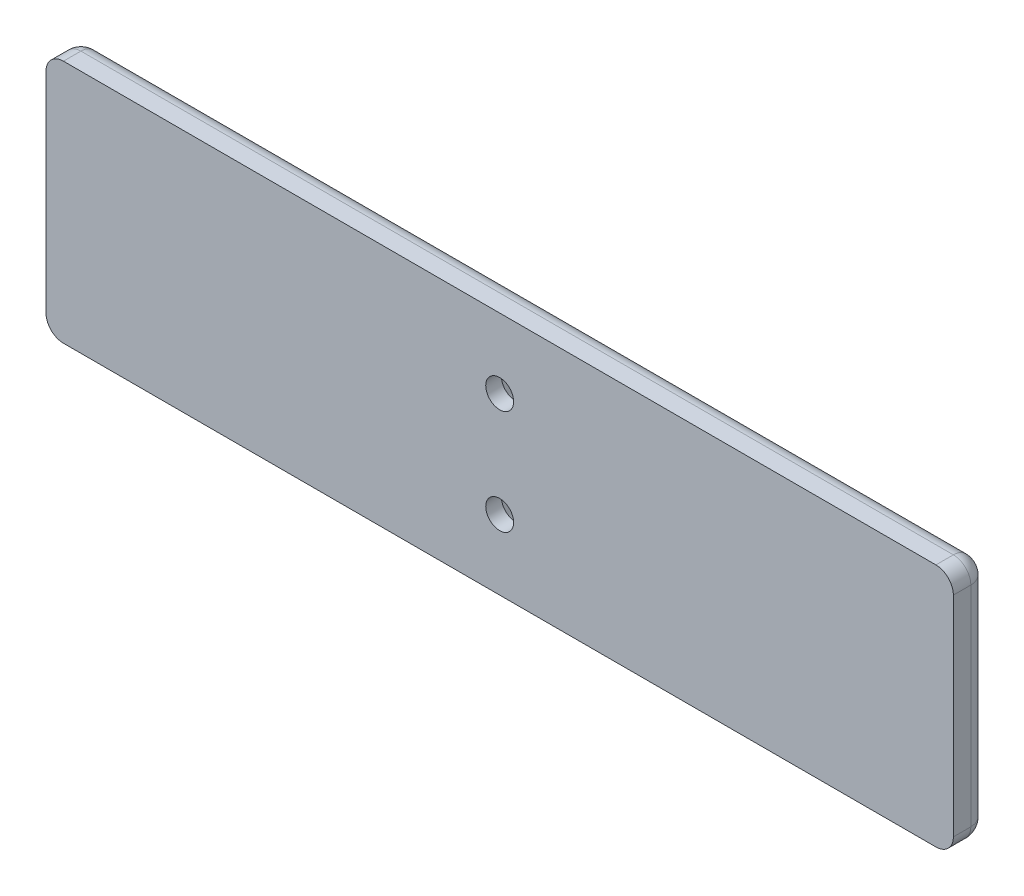
ISO-10303-21;
HEADER;
FILE_DESCRIPTION(('STEP AP214'),'2;1');
FILE_NAME('part.step','',(''),(''),'','','');
FILE_SCHEMA(('AUTOMOTIVE_DESIGN { 1 0 10303 214 1 1 1 1 }'));
ENDSEC;
DATA;
#1=APPLICATION_CONTEXT('core data for automotive mechanical design processes');
#2=APPLICATION_PROTOCOL_DEFINITION('international standard','automotive_design',2000,#1);
#3=PRODUCT_CONTEXT('',#1,'mechanical');
#4=PRODUCT('Part','Part','',(#3));
#5=PRODUCT_RELATED_PRODUCT_CATEGORY('part','',(#4));
#6=PRODUCT_DEFINITION_FORMATION('','',#4);
#7=PRODUCT_DEFINITION_CONTEXT('part definition',#1,'design');
#8=PRODUCT_DEFINITION('design','',#6,#7);
#9=PRODUCT_DEFINITION_SHAPE('','',#8);
#10=(LENGTH_UNIT() NAMED_UNIT(*) SI_UNIT(.MILLI.,.METRE.));
#11=(NAMED_UNIT(*) PLANE_ANGLE_UNIT() SI_UNIT($,.RADIAN.));
#12=(NAMED_UNIT(*) SI_UNIT($,.STERADIAN.) SOLID_ANGLE_UNIT());
#13=UNCERTAINTY_MEASURE_WITH_UNIT(LENGTH_MEASURE(1.E-05),#10,'distance_accuracy_value','');
#14=(GEOMETRIC_REPRESENTATION_CONTEXT(3) GLOBAL_UNCERTAINTY_ASSIGNED_CONTEXT((#13)) GLOBAL_UNIT_ASSIGNED_CONTEXT((#10,
#11,#12)) REPRESENTATION_CONTEXT('',''));
#15=CARTESIAN_POINT('',(0.,0.,0.));
#16=DIRECTION('',(0.,0.,1.));
#17=DIRECTION('',(1.,0.,0.));
#18=AXIS2_PLACEMENT_3D('',#15,#16,#17);
#19=CARTESIAN_POINT('',(52.,14.,2.));
#20=DIRECTION('',(-1.,0.,0.));
#21=DIRECTION('',(0.,-1.,0.));
#22=AXIS2_PLACEMENT_3D('',#19,#20,#21);
#23=PLANE('',#22);
#24=DIRECTION('',(0.,1.,0.));
#25=VECTOR('',#24,1.);
#26=CARTESIAN_POINT('',(52.,14.,1.));
#27=LINE('',#26,#25);
#28=CARTESIAN_POINT('',(52.,1.,1.));
#29=VERTEX_POINT('',#28);
#30=CARTESIAN_POINT('',(52.,13.,1.));
#31=VERTEX_POINT('',#30);
#32=EDGE_CURVE('E162',#29,#31,#27,.T.);
#33=ORIENTED_EDGE('',*,*,#32,.T.);
#34=DIRECTION('',(0.,0.,-1.));
#35=VECTOR('',#34,1.);
#36=CARTESIAN_POINT('',(52.,13.,2.));
#37=LINE('',#36,#35);
#38=CARTESIAN_POINT('',(52.,13.,2.));
#39=VERTEX_POINT('',#38);
#40=EDGE_CURVE('E168',#31,#39,#37,.F.);
#41=ORIENTED_EDGE('',*,*,#40,.T.);
#42=DIRECTION('',(0.,1.,0.));
#43=VECTOR('',#42,1.);
#44=CARTESIAN_POINT('',(52.,14.,2.));
#45=LINE('',#44,#43);
#46=CARTESIAN_POINT('',(52.,1.,2.));
#47=VERTEX_POINT('',#46);
#48=EDGE_CURVE('E202',#47,#39,#45,.T.);
#49=ORIENTED_EDGE('',*,*,#48,.F.);
#50=DIRECTION('',(0.,0.,-1.));
#51=VECTOR('',#50,1.);
#52=CARTESIAN_POINT('',(52.,1.,2.));
#53=LINE('',#52,#51);
#54=EDGE_CURVE('E165',#47,#29,#53,.T.);
#55=ORIENTED_EDGE('',*,*,#54,.T.);
#56=EDGE_LOOP('',(#33,#41,#49,#55));
#57=FACE_BOUND('',#56,.T.);
#58=ADVANCED_FACE('F39',(#57),#23,.F.);
#59=CARTESIAN_POINT('',(52.,14.,2.));
#60=DIRECTION('',(0.,-1.,0.));
#61=DIRECTION('',(1.,0.,0.));
#62=AXIS2_PLACEMENT_3D('',#59,#60,#61);
#63=PLANE('',#62);
#64=DIRECTION('',(-1.,0.,0.));
#65=VECTOR('',#64,1.);
#66=CARTESIAN_POINT('',(0.,14.,1.));
#67=LINE('',#66,#65);
#68=CARTESIAN_POINT('',(51.,14.,1.));
#69=VERTEX_POINT('',#68);
#70=CARTESIAN_POINT('',(1.,14.,1.));
#71=VERTEX_POINT('',#70);
#72=EDGE_CURVE('E130',#69,#71,#67,.T.);
#73=ORIENTED_EDGE('',*,*,#72,.T.);
#74=DIRECTION('',(0.,0.,-1.));
#75=VECTOR('',#74,1.);
#76=CARTESIAN_POINT('',(1.,14.,2.));
#77=LINE('',#76,#75);
#78=CARTESIAN_POINT('',(1.00000000000001,14.,2.));
#79=VERTEX_POINT('',#78);
#80=EDGE_CURVE('E159',#71,#79,#77,.F.);
#81=ORIENTED_EDGE('',*,*,#80,.T.);
#82=DIRECTION('',(-1.,0.,0.));
#83=VECTOR('',#82,1.);
#84=CARTESIAN_POINT('',(52.,14.,2.));
#85=LINE('',#84,#83);
#86=CARTESIAN_POINT('',(51.,14.,2.));
#87=VERTEX_POINT('',#86);
#88=EDGE_CURVE('E209',#87,#79,#85,.T.);
#89=ORIENTED_EDGE('',*,*,#88,.F.);
#90=DIRECTION('',(0.,0.,-1.));
#91=VECTOR('',#90,1.);
#92=CARTESIAN_POINT('',(51.,14.,2.));
#93=LINE('',#92,#91);
#94=EDGE_CURVE('E156',#87,#69,#93,.T.);
#95=ORIENTED_EDGE('',*,*,#94,.T.);
#96=EDGE_LOOP('',(#73,#81,#89,#95));
#97=FACE_BOUND('',#96,.T.);
#98=ADVANCED_FACE('F266',(#97),#63,.F.);
#99=CARTESIAN_POINT('',(0.,14.,2.));
#100=DIRECTION('',(1.,0.,0.));
#101=DIRECTION('',(0.,0.,-1.));
#102=AXIS2_PLACEMENT_3D('',#99,#100,#101);
#103=PLANE('',#102);
#104=DIRECTION('',(0.,-1.,0.));
#105=VECTOR('',#104,1.);
#106=CARTESIAN_POINT('',(0.,0.,1.));
#107=LINE('',#106,#105);
#108=CARTESIAN_POINT('',(0.,13.,1.));
#109=VERTEX_POINT('',#108);
#110=CARTESIAN_POINT('',(0.,1.,1.));
#111=VERTEX_POINT('',#110);
#112=EDGE_CURVE('E145',#109,#111,#107,.T.);
#113=ORIENTED_EDGE('',*,*,#112,.T.);
#114=DIRECTION('',(0.,0.,-1.));
#115=VECTOR('',#114,1.);
#116=CARTESIAN_POINT('',(0.,1.,2.));
#117=LINE('',#116,#115);
#118=CARTESIAN_POINT('',(0.,1.,2.));
#119=VERTEX_POINT('',#118);
#120=EDGE_CURVE('E148',#111,#119,#117,.F.);
#121=ORIENTED_EDGE('',*,*,#120,.T.);
#122=DIRECTION('',(0.,-1.,0.));
#123=VECTOR('',#122,1.);
#124=CARTESIAN_POINT('',(0.,14.,2.));
#125=LINE('',#124,#123);
#126=CARTESIAN_POINT('',(0.,13.,2.));
#127=VERTEX_POINT('',#126);
#128=EDGE_CURVE('E124',#127,#119,#125,.T.);
#129=ORIENTED_EDGE('',*,*,#128,.F.);
#130=DIRECTION('',(0.,0.,-1.));
#131=VECTOR('',#130,1.);
#132=CARTESIAN_POINT('',(0.,13.,2.));
#133=LINE('',#132,#131);
#134=EDGE_CURVE('E144',#127,#109,#133,.T.);
#135=ORIENTED_EDGE('',*,*,#134,.T.);
#136=EDGE_LOOP('',(#113,#121,#129,#135));
#137=FACE_BOUND('',#136,.T.);
#138=ADVANCED_FACE('F236',(#137),#103,.F.);
#139=CARTESIAN_POINT('',(52.,0.,2.));
#140=DIRECTION('',(0.,1.,0.));
#141=DIRECTION('',(0.,0.,1.));
#142=AXIS2_PLACEMENT_3D('',#139,#140,#141);
#143=PLANE('',#142);
#144=DIRECTION('',(1.,0.,0.));
#145=VECTOR('',#144,1.);
#146=CARTESIAN_POINT('',(52.,0.,2.));
#147=LINE('',#146,#145);
#148=CARTESIAN_POINT('',(1.,0.,2.));
#149=VERTEX_POINT('',#148);
#150=CARTESIAN_POINT('',(51.,0.,2.));
#151=VERTEX_POINT('',#150);
#152=EDGE_CURVE('E119',#149,#151,#147,.T.);
#153=ORIENTED_EDGE('',*,*,#152,.F.);
#154=DIRECTION('',(0.,0.,-1.));
#155=VECTOR('',#154,1.);
#156=CARTESIAN_POINT('',(1.,0.,2.));
#157=LINE('',#156,#155);
#158=CARTESIAN_POINT('',(1.,0.,1.));
#159=VERTEX_POINT('',#158);
#160=EDGE_CURVE('E132',#149,#159,#157,.T.);
#161=ORIENTED_EDGE('',*,*,#160,.T.);
#162=DIRECTION('',(1.,0.,0.));
#163=VECTOR('',#162,1.);
#164=CARTESIAN_POINT('',(52.,0.,1.));
#165=LINE('',#164,#163);
#166=CARTESIAN_POINT('',(51.,0.,1.));
#167=VERTEX_POINT('',#166);
#168=EDGE_CURVE('E138',#159,#167,#165,.T.);
#169=ORIENTED_EDGE('',*,*,#168,.T.);
#170=DIRECTION('',(0.,0.,-1.));
#171=VECTOR('',#170,1.);
#172=CARTESIAN_POINT('',(51.,0.,2.));
#173=LINE('',#172,#171);
#174=EDGE_CURVE('E134',#167,#151,#173,.F.);
#175=ORIENTED_EDGE('',*,*,#174,.T.);
#176=EDGE_LOOP('',(#153,#161,#169,#175));
#177=FACE_BOUND('',#176,.T.);
#178=ADVANCED_FACE('F135',(#177),#143,.F.);
#179=CARTESIAN_POINT('',(0.,0.,2.));
#180=DIRECTION('',(0.,0.,-1.));
#181=DIRECTION('',(-1.,0.,0.));
#182=AXIS2_PLACEMENT_3D('',#179,#180,#181);
#183=PLANE('',#182);
#184=CARTESIAN_POINT('',(26.,3.99999999999999,2.));
#185=DIRECTION('',(0.,0.,-1.));
#186=DIRECTION('',(0.,1.,0.));
#187=AXIS2_PLACEMENT_3D('',#184,#185,#186);
#188=CIRCLE('',#187,0.799999999999999);
#189=CARTESIAN_POINT('',(26.,4.79999999999999,2.));
#190=VERTEX_POINT('',#189);
#191=EDGE_CURVE('E434',#190,#190,#188,.T.);
#192=ORIENTED_EDGE('',*,*,#191,.T.);
#193=EDGE_LOOP('',(#192));
#194=FACE_BOUND('',#193,.T.);
#195=CARTESIAN_POINT('',(26.,9.99999999999999,2.));
#196=DIRECTION('',(0.,0.,-1.));
#197=DIRECTION('',(-1.,0.,0.));
#198=AXIS2_PLACEMENT_3D('',#195,#196,#197);
#199=CIRCLE('',#198,0.8);
#200=CARTESIAN_POINT('',(25.2,9.99999999999999,2.));
#201=VERTEX_POINT('',#200);
#202=EDGE_CURVE('E172',#201,#201,#199,.T.);
#203=ORIENTED_EDGE('',*,*,#202,.T.);
#204=EDGE_LOOP('',(#203));
#205=FACE_BOUND('',#204,.T.);
#206=ORIENTED_EDGE('',*,*,#128,.T.);
#207=CARTESIAN_POINT('',(1.,1.,2.));
#208=DIRECTION('',(0.,0.,-1.));
#209=DIRECTION('',(-1.,0.,0.));
#210=AXIS2_PLACEMENT_3D('',#207,#208,#209);
#211=CIRCLE('',#210,1.);
#212=EDGE_CURVE('E120',#119,#149,#211,.F.);
#213=ORIENTED_EDGE('',*,*,#212,.T.);
#214=ORIENTED_EDGE('',*,*,#152,.T.);
#215=CARTESIAN_POINT('',(51.,1.,2.));
#216=DIRECTION('',(0.,0.,-1.));
#217=DIRECTION('',(-1.,0.,0.));
#218=AXIS2_PLACEMENT_3D('',#215,#216,#217);
#219=CIRCLE('',#218,1.);
#220=EDGE_CURVE('E155',#151,#47,#219,.F.);
#221=ORIENTED_EDGE('',*,*,#220,.T.);
#222=ORIENTED_EDGE('',*,*,#48,.T.);
#223=CARTESIAN_POINT('',(51.,13.,2.));
#224=DIRECTION('',(0.,0.,-1.));
#225=DIRECTION('',(-1.,0.,0.));
#226=AXIS2_PLACEMENT_3D('',#223,#224,#225);
#227=CIRCLE('',#226,1.);
#228=EDGE_CURVE('E153',#39,#87,#227,.F.);
#229=ORIENTED_EDGE('',*,*,#228,.T.);
#230=ORIENTED_EDGE('',*,*,#88,.T.);
#231=CARTESIAN_POINT('',(1.,13.,2.));
#232=DIRECTION('',(0.,0.,-1.));
#233=DIRECTION('',(-1.,0.,0.));
#234=AXIS2_PLACEMENT_3D('',#231,#232,#233);
#235=CIRCLE('',#234,1.);
#236=EDGE_CURVE('E129',#79,#127,#235,.F.);
#237=ORIENTED_EDGE('',*,*,#236,.T.);
#238=EDGE_LOOP('',(#206,#213,#214,#221,#222,#229,#230,#237));
#239=FACE_BOUND('',#238,.T.);
#240=ADVANCED_FACE('F118',(#194,#205,#239),#183,.F.);
#241=CARTESIAN_POINT('',(0.,0.,0.));
#242=DIRECTION('',(0.,0.,-1.));
#243=DIRECTION('',(-1.,0.,0.));
#244=AXIS2_PLACEMENT_3D('',#241,#242,#243);
#245=PLANE('',#244);
#246=CARTESIAN_POINT('',(26.,3.99999999999999,0.));
#247=DIRECTION('',(0.,0.,-1.));
#248=DIRECTION('',(0.,1.,0.));
#249=AXIS2_PLACEMENT_3D('',#246,#247,#248);
#250=CIRCLE('',#249,1.4);
#251=CARTESIAN_POINT('',(26.,5.4,0.));
#252=VERTEX_POINT('',#251);
#253=EDGE_CURVE('E431',#252,#252,#250,.T.);
#254=ORIENTED_EDGE('',*,*,#253,.F.);
#255=EDGE_LOOP('',(#254));
#256=FACE_BOUND('',#255,.T.);
#257=CARTESIAN_POINT('',(26.,9.99999999999999,0.));
#258=DIRECTION('',(0.,0.,-1.));
#259=DIRECTION('',(-1.,0.,0.));
#260=AXIS2_PLACEMENT_3D('',#257,#258,#259);
#261=CIRCLE('',#260,1.4);
#262=CARTESIAN_POINT('',(24.6,9.99999999999999,0.));
#263=VERTEX_POINT('',#262);
#264=EDGE_CURVE('E438',#263,#263,#261,.T.);
#265=ORIENTED_EDGE('',*,*,#264,.F.);
#266=EDGE_LOOP('',(#265));
#267=FACE_BOUND('',#266,.T.);
#268=DIRECTION('',(1.,0.,0.));
#269=VECTOR('',#268,1.);
#270=CARTESIAN_POINT('',(0.,1.,0.));
#271=LINE('',#270,#269);
#272=CARTESIAN_POINT('',(51.,1.,0.));
#273=VERTEX_POINT('',#272);
#274=CARTESIAN_POINT('',(1.,1.,0.));
#275=VERTEX_POINT('',#274);
#276=EDGE_CURVE('E48',#273,#275,#271,.F.);
#277=ORIENTED_EDGE('',*,*,#276,.T.);
#278=DIRECTION('',(0.,-1.,0.));
#279=VECTOR('',#278,1.);
#280=CARTESIAN_POINT('',(1.,14.,0.));
#281=LINE('',#280,#279);
#282=CARTESIAN_POINT('',(1.,13.,0.));
#283=VERTEX_POINT('',#282);
#284=EDGE_CURVE('E11',#275,#283,#281,.F.);
#285=ORIENTED_EDGE('',*,*,#284,.T.);
#286=DIRECTION('',(-1.,0.,0.));
#287=VECTOR('',#286,1.);
#288=CARTESIAN_POINT('',(52.,13.,0.));
#289=LINE('',#288,#287);
#290=CARTESIAN_POINT('',(51.,13.,0.));
#291=VERTEX_POINT('',#290);
#292=EDGE_CURVE('E166',#283,#291,#289,.F.);
#293=ORIENTED_EDGE('',*,*,#292,.T.);
#294=DIRECTION('',(0.,1.,0.));
#295=VECTOR('',#294,1.);
#296=CARTESIAN_POINT('',(51.,0.,0.));
#297=LINE('',#296,#295);
#298=EDGE_CURVE('E56',#291,#273,#297,.F.);
#299=ORIENTED_EDGE('',*,*,#298,.T.);
#300=EDGE_LOOP('',(#277,#285,#293,#299));
#301=FACE_BOUND('',#300,.T.);
#302=ADVANCED_FACE('F252',(#256,#267,#301),#245,.T.);
#303=CARTESIAN_POINT('',(51.,13.,2.));
#304=DIRECTION('',(0.,0.,-1.));
#305=DIRECTION('',(-1.,0.,0.));
#306=AXIS2_PLACEMENT_3D('',#303,#304,#305);
#307=CYLINDRICAL_SURFACE('',#306,1.);
#308=CARTESIAN_POINT('',(51.,13.,1.));
#309=DIRECTION('',(0.,0.,-1.));
#310=DIRECTION('',(-1.,0.,0.));
#311=AXIS2_PLACEMENT_3D('',#308,#309,#310);
#312=CIRCLE('',#311,1.);
#313=EDGE_CURVE('E43',#69,#31,#312,.T.);
#314=ORIENTED_EDGE('',*,*,#313,.F.);
#315=ORIENTED_EDGE('',*,*,#94,.F.);
#316=ORIENTED_EDGE('',*,*,#228,.F.);
#317=ORIENTED_EDGE('',*,*,#40,.F.);
#318=EDGE_LOOP('',(#314,#315,#316,#317));
#319=FACE_BOUND('',#318,.T.);
#320=ADVANCED_FACE('F41',(#319),#307,.T.);
#321=CARTESIAN_POINT('',(51.,13.,1.));
#322=DIRECTION('',(1.,0.,0.));
#323=DIRECTION('',(0.,0.,-1.));
#324=AXIS2_PLACEMENT_3D('',#321,#322,#323);
#325=SPHERICAL_SURFACE('',#324,1.);
#326=CARTESIAN_POINT('',(51.,13.,1.));
#327=DIRECTION('',(1.,0.,0.));
#328=DIRECTION('',(0.,0.,-1.));
#329=AXIS2_PLACEMENT_3D('',#326,#327,#328);
#330=CIRCLE('',#329,1.);
#331=EDGE_CURVE('E196',#69,#291,#330,.F.);
#332=ORIENTED_EDGE('',*,*,#331,.F.);
#333=ORIENTED_EDGE('',*,*,#313,.T.);
#334=CARTESIAN_POINT('',(51.,13.,1.));
#335=DIRECTION('',(0.,1.,0.));
#336=DIRECTION('',(0.,0.,1.));
#337=AXIS2_PLACEMENT_3D('',#334,#335,#336);
#338=CIRCLE('',#337,1.);
#339=EDGE_CURVE('E197',#291,#31,#338,.F.);
#340=ORIENTED_EDGE('',*,*,#339,.F.);
#341=EDGE_LOOP('',(#332,#333,#340));
#342=FACE_BOUND('',#341,.T.);
#343=ADVANCED_FACE('F258',(#342),#325,.T.);
#344=CARTESIAN_POINT('',(51.,1.,2.));
#345=DIRECTION('',(0.,0.,-1.));
#346=DIRECTION('',(-1.,0.,0.));
#347=AXIS2_PLACEMENT_3D('',#344,#345,#346);
#348=CYLINDRICAL_SURFACE('',#347,1.);
#349=ORIENTED_EDGE('',*,*,#220,.F.);
#350=ORIENTED_EDGE('',*,*,#174,.F.);
#351=CARTESIAN_POINT('',(51.,1.,1.));
#352=DIRECTION('',(0.,0.,-1.));
#353=DIRECTION('',(-1.,0.,0.));
#354=AXIS2_PLACEMENT_3D('',#351,#352,#353);
#355=CIRCLE('',#354,1.);
#356=EDGE_CURVE('E194',#29,#167,#355,.T.);
#357=ORIENTED_EDGE('',*,*,#356,.F.);
#358=ORIENTED_EDGE('',*,*,#54,.F.);
#359=EDGE_LOOP('',(#349,#350,#357,#358));
#360=FACE_BOUND('',#359,.T.);
#361=ADVANCED_FACE('F221',(#360),#348,.T.);
#362=CARTESIAN_POINT('',(51.,14.,1.));
#363=DIRECTION('',(0.,-1.,0.));
#364=DIRECTION('',(1.,0.,0.));
#365=AXIS2_PLACEMENT_3D('',#362,#363,#364);
#366=CYLINDRICAL_SURFACE('',#365,1.);
#367=ORIENTED_EDGE('',*,*,#339,.T.);
#368=ORIENTED_EDGE('',*,*,#32,.F.);
#369=CARTESIAN_POINT('',(51.,1.,1.));
#370=DIRECTION('',(0.,-1.,0.));
#371=DIRECTION('',(1.,0.,0.));
#372=AXIS2_PLACEMENT_3D('',#369,#370,#371);
#373=CIRCLE('',#372,1.);
#374=EDGE_CURVE('E188',#273,#29,#373,.T.);
#375=ORIENTED_EDGE('',*,*,#374,.F.);
#376=ORIENTED_EDGE('',*,*,#298,.F.);
#377=EDGE_LOOP('',(#367,#368,#375,#376));
#378=FACE_BOUND('',#377,.T.);
#379=ADVANCED_FACE('F294',(#378),#366,.T.);
#380=CARTESIAN_POINT('',(52.,13.,1.));
#381=DIRECTION('',(1.,0.,0.));
#382=DIRECTION('',(0.,1.,0.));
#383=AXIS2_PLACEMENT_3D('',#380,#381,#382);
#384=CYLINDRICAL_SURFACE('',#383,1.);
#385=ORIENTED_EDGE('',*,*,#331,.T.);
#386=ORIENTED_EDGE('',*,*,#292,.F.);
#387=CARTESIAN_POINT('',(1.,13.,1.));
#388=DIRECTION('',(-1.,0.,0.));
#389=DIRECTION('',(0.,-1.,0.));
#390=AXIS2_PLACEMENT_3D('',#387,#388,#389);
#391=CIRCLE('',#390,1.);
#392=EDGE_CURVE('E190',#71,#283,#391,.T.);
#393=ORIENTED_EDGE('',*,*,#392,.F.);
#394=ORIENTED_EDGE('',*,*,#72,.F.);
#395=EDGE_LOOP('',(#385,#386,#393,#394));
#396=FACE_BOUND('',#395,.T.);
#397=ADVANCED_FACE('F249',(#396),#384,.T.);
#398=CARTESIAN_POINT('',(1.,13.,2.));
#399=DIRECTION('',(0.,0.,-1.));
#400=DIRECTION('',(-1.,0.,0.));
#401=AXIS2_PLACEMENT_3D('',#398,#399,#400);
#402=CYLINDRICAL_SURFACE('',#401,1.);
#403=ORIENTED_EDGE('',*,*,#236,.F.);
#404=ORIENTED_EDGE('',*,*,#80,.F.);
#405=CARTESIAN_POINT('',(1.,13.,1.));
#406=DIRECTION('',(0.,0.,-1.));
#407=DIRECTION('',(-1.,0.,0.));
#408=AXIS2_PLACEMENT_3D('',#405,#406,#407);
#409=CIRCLE('',#408,1.);
#410=EDGE_CURVE('E183',#109,#71,#409,.T.);
#411=ORIENTED_EDGE('',*,*,#410,.F.);
#412=ORIENTED_EDGE('',*,*,#134,.F.);
#413=EDGE_LOOP('',(#403,#404,#411,#412));
#414=FACE_BOUND('',#413,.T.);
#415=ADVANCED_FACE('F243',(#414),#402,.T.);
#416=CARTESIAN_POINT('',(51.,1.,1.));
#417=DIRECTION('',(1.,0.,0.));
#418=DIRECTION('',(0.,1.,0.));
#419=AXIS2_PLACEMENT_3D('',#416,#417,#418);
#420=SPHERICAL_SURFACE('',#419,1.);
#421=ORIENTED_EDGE('',*,*,#374,.T.);
#422=ORIENTED_EDGE('',*,*,#356,.T.);
#423=CARTESIAN_POINT('',(51.,1.,1.));
#424=DIRECTION('',(1.,0.,0.));
#425=DIRECTION('',(0.,0.,-1.));
#426=AXIS2_PLACEMENT_3D('',#423,#424,#425);
#427=CIRCLE('',#426,1.);
#428=EDGE_CURVE('E181',#273,#167,#427,.F.);
#429=ORIENTED_EDGE('',*,*,#428,.F.);
#430=EDGE_LOOP('',(#421,#422,#429));
#431=FACE_BOUND('',#430,.T.);
#432=ADVANCED_FACE('F227',(#431),#420,.T.);
#433=CARTESIAN_POINT('',(1.,13.,1.));
#434=DIRECTION('',(0.,1.,0.));
#435=DIRECTION('',(-1.,0.,0.));
#436=AXIS2_PLACEMENT_3D('',#433,#434,#435);
#437=SPHERICAL_SURFACE('',#436,1.);
#438=ORIENTED_EDGE('',*,*,#410,.T.);
#439=ORIENTED_EDGE('',*,*,#392,.T.);
#440=CARTESIAN_POINT('',(1.,13.,1.));
#441=DIRECTION('',(0.,1.,0.));
#442=DIRECTION('',(0.,0.,1.));
#443=AXIS2_PLACEMENT_3D('',#440,#441,#442);
#444=CIRCLE('',#443,1.);
#445=EDGE_CURVE('E177',#109,#283,#444,.F.);
#446=ORIENTED_EDGE('',*,*,#445,.F.);
#447=EDGE_LOOP('',(#438,#439,#446));
#448=FACE_BOUND('',#447,.T.);
#449=ADVANCED_FACE('F246',(#448),#437,.T.);
#450=CARTESIAN_POINT('',(52.,1.,1.));
#451=DIRECTION('',(-1.,0.,0.));
#452=DIRECTION('',(0.,0.,1.));
#453=AXIS2_PLACEMENT_3D('',#450,#451,#452);
#454=CYLINDRICAL_SURFACE('',#453,1.);
#455=ORIENTED_EDGE('',*,*,#428,.T.);
#456=ORIENTED_EDGE('',*,*,#168,.F.);
#457=CARTESIAN_POINT('',(1.,1.,1.));
#458=DIRECTION('',(-1.,0.,0.));
#459=DIRECTION('',(0.,-1.,0.));
#460=AXIS2_PLACEMENT_3D('',#457,#458,#459);
#461=CIRCLE('',#460,1.);
#462=EDGE_CURVE('E180',#275,#159,#461,.T.);
#463=ORIENTED_EDGE('',*,*,#462,.F.);
#464=ORIENTED_EDGE('',*,*,#276,.F.);
#465=EDGE_LOOP('',(#455,#456,#463,#464));
#466=FACE_BOUND('',#465,.T.);
#467=ADVANCED_FACE('F226',(#466),#454,.T.);
#468=CARTESIAN_POINT('',(1.,14.,1.));
#469=DIRECTION('',(0.,1.,0.));
#470=DIRECTION('',(0.,0.,1.));
#471=AXIS2_PLACEMENT_3D('',#468,#469,#470);
#472=CYLINDRICAL_SURFACE('',#471,1.);
#473=ORIENTED_EDGE('',*,*,#445,.T.);
#474=ORIENTED_EDGE('',*,*,#284,.F.);
#475=CARTESIAN_POINT('',(1.,1.,1.));
#476=DIRECTION('',(0.,-1.,0.));
#477=DIRECTION('',(0.,0.,-1.));
#478=AXIS2_PLACEMENT_3D('',#475,#476,#477);
#479=CIRCLE('',#478,1.);
#480=EDGE_CURVE('E173',#111,#275,#479,.T.);
#481=ORIENTED_EDGE('',*,*,#480,.F.);
#482=ORIENTED_EDGE('',*,*,#112,.F.);
#483=EDGE_LOOP('',(#473,#474,#481,#482));
#484=FACE_BOUND('',#483,.T.);
#485=ADVANCED_FACE('F234',(#484),#472,.T.);
#486=CARTESIAN_POINT('',(1.,1.,1.));
#487=DIRECTION('',(0.,0.,-1.));
#488=DIRECTION('',(-1.,0.,0.));
#489=AXIS2_PLACEMENT_3D('',#486,#487,#488);
#490=SPHERICAL_SURFACE('',#489,1.);
#491=ORIENTED_EDGE('',*,*,#480,.T.);
#492=ORIENTED_EDGE('',*,*,#462,.T.);
#493=CARTESIAN_POINT('',(1.,1.,1.));
#494=DIRECTION('',(0.,0.,-1.));
#495=DIRECTION('',(-1.,0.,0.));
#496=AXIS2_PLACEMENT_3D('',#493,#494,#495);
#497=CIRCLE('',#496,1.);
#498=EDGE_CURVE('E139',#111,#159,#497,.F.);
#499=ORIENTED_EDGE('',*,*,#498,.F.);
#500=EDGE_LOOP('',(#491,#492,#499));
#501=FACE_BOUND('',#500,.T.);
#502=ADVANCED_FACE('F233',(#501),#490,.T.);
#503=CARTESIAN_POINT('',(1.,1.,2.));
#504=DIRECTION('',(0.,0.,-1.));
#505=DIRECTION('',(-1.,0.,0.));
#506=AXIS2_PLACEMENT_3D('',#503,#504,#505);
#507=CYLINDRICAL_SURFACE('',#506,1.);
#508=ORIENTED_EDGE('',*,*,#212,.F.);
#509=ORIENTED_EDGE('',*,*,#120,.F.);
#510=ORIENTED_EDGE('',*,*,#498,.T.);
#511=ORIENTED_EDGE('',*,*,#160,.F.);
#512=EDGE_LOOP('',(#508,#509,#510,#511));
#513=FACE_BOUND('',#512,.T.);
#514=ADVANCED_FACE('F136',(#513),#507,.T.);
#515=CARTESIAN_POINT('',(26.,9.99999999999999,0.));
#516=DIRECTION('',(0.,0.,-1.));
#517=DIRECTION('',(-1.,0.,0.));
#518=AXIS2_PLACEMENT_3D('',#515,#516,#517);
#519=CYLINDRICAL_SURFACE('',#518,0.8);
#520=ORIENTED_EDGE('',*,*,#202,.F.);
#521=EDGE_LOOP('',(#520));
#522=FACE_BOUND('',#521,.T.);
#523=CARTESIAN_POINT('',(26.,9.99999999999999,1.1));
#524=DIRECTION('',(0.,0.,-1.));
#525=DIRECTION('',(-1.,0.,0.));
#526=AXIS2_PLACEMENT_3D('',#523,#524,#525);
#527=CIRCLE('',#526,0.8);
#528=CARTESIAN_POINT('',(25.2,9.99999999999999,1.1));
#529=VERTEX_POINT('',#528);
#530=EDGE_CURVE('E442',#529,#529,#527,.T.);
#531=ORIENTED_EDGE('',*,*,#530,.T.);
#532=EDGE_LOOP('',(#531));
#533=FACE_BOUND('',#532,.T.);
#534=ADVANCED_FACE('F278',(#522,#533),#519,.F.);
#535=CARTESIAN_POINT('',(26.,9.99999999999999,0.));
#536=DIRECTION('',(0.,0.,-1.));
#537=DIRECTION('',(-1.,0.,0.));
#538=AXIS2_PLACEMENT_3D('',#535,#536,#537);
#539=CONICAL_SURFACE('',#538,1.4,0.49934672168013);
#540=ORIENTED_EDGE('',*,*,#530,.F.);
#541=EDGE_LOOP('',(#540));
#542=FACE_BOUND('',#541,.T.);
#543=ORIENTED_EDGE('',*,*,#264,.T.);
#544=EDGE_LOOP('',(#543));
#545=FACE_BOUND('',#544,.T.);
#546=ADVANCED_FACE('F362',(#542,#545),#539,.F.);
#547=CARTESIAN_POINT('',(26.,3.99999999999999,0.));
#548=DIRECTION('',(0.,0.,-1.));
#549=DIRECTION('',(0.,1.,0.));
#550=AXIS2_PLACEMENT_3D('',#547,#548,#549);
#551=CYLINDRICAL_SURFACE('',#550,0.799999999999999);
#552=CARTESIAN_POINT('',(26.,3.99999999999999,1.1));
#553=DIRECTION('',(0.,0.,-1.));
#554=DIRECTION('',(0.,1.,0.));
#555=AXIS2_PLACEMENT_3D('',#552,#553,#554);
#556=CIRCLE('',#555,0.8);
#557=CARTESIAN_POINT('',(26.,4.79999999999999,1.1));
#558=VERTEX_POINT('',#557);
#559=EDGE_CURVE('E432',#558,#558,#556,.T.);
#560=ORIENTED_EDGE('',*,*,#559,.T.);
#561=EDGE_LOOP('',(#560));
#562=FACE_BOUND('',#561,.T.);
#563=ORIENTED_EDGE('',*,*,#191,.F.);
#564=EDGE_LOOP('',(#563));
#565=FACE_BOUND('',#564,.T.);
#566=ADVANCED_FACE('F373',(#562,#565),#551,.F.);
#567=CARTESIAN_POINT('',(26.,3.99999999999999,1.1));
#568=DIRECTION('',(0.,0.,-1.));
#569=DIRECTION('',(0.,1.,0.));
#570=AXIS2_PLACEMENT_3D('',#567,#568,#569);
#571=CONICAL_SURFACE('',#570,0.799999999999999,0.499346721680131);
#572=ORIENTED_EDGE('',*,*,#253,.T.);
#573=EDGE_LOOP('',(#572));
#574=FACE_BOUND('',#573,.T.);
#575=ORIENTED_EDGE('',*,*,#559,.F.);
#576=EDGE_LOOP('',(#575));
#577=FACE_BOUND('',#576,.T.);
#578=ADVANCED_FACE('F414',(#574,#577),#571,.F.);
#579=CLOSED_SHELL('',(#58,#98,#138,#178,#240,#302,#320,#343,#361,#379,#397,#415,#432,#449,#467,
#485,#502,#514,#534,#546,#566,#578));
#580=MANIFOLD_SOLID_BREP('B2',#579);
#581=ADVANCED_BREP_SHAPE_REPRESENTATION('',(#18,#580),#14);
#582=SHAPE_DEFINITION_REPRESENTATION(#9,#581);
ENDSEC;
END-ISO-10303-21;
